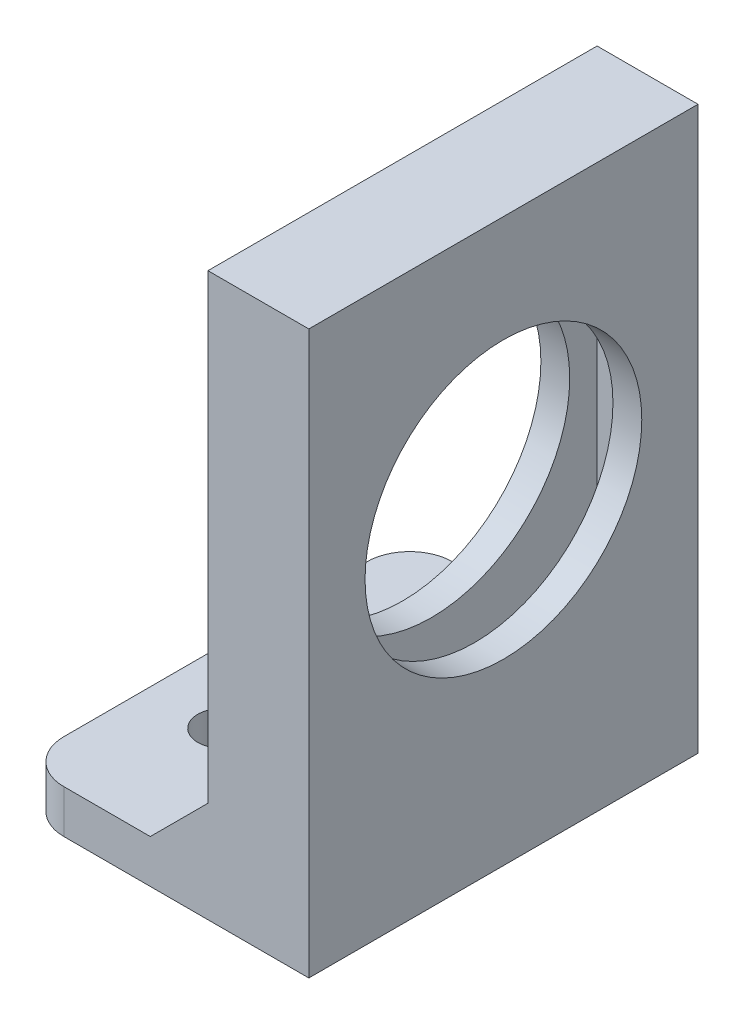
ISO-10303-21;
HEADER;
FILE_DESCRIPTION(('STEP AP214'),'2;1');
FILE_NAME('part.step','',(''),(''),'','','');
FILE_SCHEMA(('AUTOMOTIVE_DESIGN { 1 0 10303 214 1 1 1 1 }'));
ENDSEC;
DATA;
#1=APPLICATION_CONTEXT('core data for automotive mechanical design processes');
#2=APPLICATION_PROTOCOL_DEFINITION('international standard','automotive_design',2000,#1);
#3=PRODUCT_CONTEXT('',#1,'mechanical');
#4=PRODUCT('Part','Part','',(#3));
#5=PRODUCT_RELATED_PRODUCT_CATEGORY('part','',(#4));
#6=PRODUCT_DEFINITION_FORMATION('','',#4);
#7=PRODUCT_DEFINITION_CONTEXT('part definition',#1,'design');
#8=PRODUCT_DEFINITION('design','',#6,#7);
#9=PRODUCT_DEFINITION_SHAPE('','',#8);
#10=(LENGTH_UNIT() NAMED_UNIT(*) SI_UNIT(.MILLI.,.METRE.));
#11=(NAMED_UNIT(*) PLANE_ANGLE_UNIT() SI_UNIT($,.RADIAN.));
#12=(NAMED_UNIT(*) SI_UNIT($,.STERADIAN.) SOLID_ANGLE_UNIT());
#13=UNCERTAINTY_MEASURE_WITH_UNIT(LENGTH_MEASURE(1.E-05),#10,'distance_accuracy_value','');
#14=(GEOMETRIC_REPRESENTATION_CONTEXT(3) GLOBAL_UNCERTAINTY_ASSIGNED_CONTEXT((#13)) GLOBAL_UNIT_ASSIGNED_CONTEXT((#10,
#11,#12)) REPRESENTATION_CONTEXT('',''));
#15=CARTESIAN_POINT('',(0.,0.,0.));
#16=DIRECTION('',(0.,0.,1.));
#17=DIRECTION('',(1.,0.,0.));
#18=AXIS2_PLACEMENT_3D('',#15,#16,#17);
#19=CARTESIAN_POINT('',(0.,3.,0.));
#20=DIRECTION('',(0.,1.,0.));
#21=DIRECTION('',(0.,0.,1.));
#22=AXIS2_PLACEMENT_3D('',#19,#20,#21);
#23=PLANE('',#22);
#24=CARTESIAN_POINT('',(5.,3.,9.));
#25=DIRECTION('',(0.,1.,0.));
#26=DIRECTION('',(0.,0.,1.));
#27=AXIS2_PLACEMENT_3D('',#24,#25,#26);
#28=CIRCLE('',#27,1.7);
#29=CARTESIAN_POINT('',(5.,3.,10.7));
#30=VERTEX_POINT('',#29);
#31=EDGE_CURVE('E175',#30,#30,#28,.T.);
#32=ORIENTED_EDGE('',*,*,#31,.F.);
#33=EDGE_LOOP('',(#32));
#34=FACE_BOUND('',#33,.T.);
#35=CARTESIAN_POINT('',(5.,3.,18.));
#36=DIRECTION('',(0.,1.,0.));
#37=DIRECTION('',(0.,0.,1.));
#38=AXIS2_PLACEMENT_3D('',#35,#36,#37);
#39=CIRCLE('',#38,1.7);
#40=CARTESIAN_POINT('',(5.,3.,19.7));
#41=VERTEX_POINT('',#40);
#42=EDGE_CURVE('E178',#41,#41,#39,.T.);
#43=ORIENTED_EDGE('',*,*,#42,.F.);
#44=EDGE_LOOP('',(#43));
#45=FACE_BOUND('',#44,.T.);
#46=DIRECTION('',(-1.,0.,0.));
#47=VECTOR('',#46,1.);
#48=CARTESIAN_POINT('',(0.,3.,0.));
#49=LINE('',#48,#47);
#50=CARTESIAN_POINT('',(9.00000000000003,3.,0.));
#51=VERTEX_POINT('',#50);
#52=CARTESIAN_POINT('',(3.,3.,0.));
#53=VERTEX_POINT('',#52);
#54=EDGE_CURVE('E238',#51,#53,#49,.T.);
#55=ORIENTED_EDGE('',*,*,#54,.T.);
#56=CARTESIAN_POINT('',(3.,3.,3.));
#57=DIRECTION('',(0.,1.,0.));
#58=DIRECTION('',(0.,0.,1.));
#59=AXIS2_PLACEMENT_3D('',#56,#57,#58);
#60=CIRCLE('',#59,3.);
#61=CARTESIAN_POINT('',(0.,3.,3.));
#62=VERTEX_POINT('',#61);
#63=EDGE_CURVE('E50',#53,#62,#60,.T.);
#64=ORIENTED_EDGE('',*,*,#63,.T.);
#65=DIRECTION('',(0.,0.,1.));
#66=VECTOR('',#65,1.);
#67=CARTESIAN_POINT('',(0.,3.,0.));
#68=LINE('',#67,#66);
#69=CARTESIAN_POINT('',(0.,3.,24.));
#70=VERTEX_POINT('',#69);
#71=EDGE_CURVE('E231',#62,#70,#68,.T.);
#72=ORIENTED_EDGE('',*,*,#71,.T.);
#73=CARTESIAN_POINT('',(3.,3.,24.));
#74=DIRECTION('',(0.,1.,0.));
#75=DIRECTION('',(0.,0.,1.));
#76=AXIS2_PLACEMENT_3D('',#73,#74,#75);
#77=CIRCLE('',#76,3.);
#78=CARTESIAN_POINT('',(3.,3.,27.));
#79=VERTEX_POINT('',#78);
#80=EDGE_CURVE('E57',#70,#79,#77,.T.);
#81=ORIENTED_EDGE('',*,*,#80,.T.);
#82=DIRECTION('',(1.,0.,0.));
#83=VECTOR('',#82,1.);
#84=CARTESIAN_POINT('',(0.,3.,27.));
#85=LINE('',#84,#83);
#86=CARTESIAN_POINT('',(9.00000000000003,3.,27.));
#87=VERTEX_POINT('',#86);
#88=EDGE_CURVE('E234',#79,#87,#85,.T.);
#89=ORIENTED_EDGE('',*,*,#88,.T.);
#90=DIRECTION('',(0.,0.,-1.));
#91=VECTOR('',#90,1.);
#92=CARTESIAN_POINT('',(9.00000000000003,3.,0.));
#93=LINE('',#92,#91);
#94=EDGE_CURVE('E266',#87,#51,#93,.T.);
#95=ORIENTED_EDGE('',*,*,#94,.T.);
#96=EDGE_LOOP('',(#55,#64,#72,#81,#89,#95));
#97=FACE_BOUND('',#96,.T.);
#98=ADVANCED_FACE('F41',(#34,#45,#97),#23,.T.);
#99=CARTESIAN_POINT('',(0.,3.,0.));
#100=DIRECTION('',(1.,0.,0.));
#101=DIRECTION('',(0.,0.,-1.));
#102=AXIS2_PLACEMENT_3D('',#99,#100,#101);
#103=PLANE('',#102);
#104=ORIENTED_EDGE('',*,*,#71,.F.);
#105=DIRECTION('',(0.,-1.,0.));
#106=VECTOR('',#105,1.);
#107=CARTESIAN_POINT('',(0.,3.,3.));
#108=LINE('',#107,#106);
#109=CARTESIAN_POINT('',(0.,0.,3.));
#110=VERTEX_POINT('',#109);
#111=EDGE_CURVE('E278',#62,#110,#108,.T.);
#112=ORIENTED_EDGE('',*,*,#111,.T.);
#113=DIRECTION('',(0.,0.,1.));
#114=VECTOR('',#113,1.);
#115=CARTESIAN_POINT('',(0.,0.,0.));
#116=LINE('',#115,#114);
#117=CARTESIAN_POINT('',(0.,0.,24.));
#118=VERTEX_POINT('',#117);
#119=EDGE_CURVE('E227',#110,#118,#116,.T.);
#120=ORIENTED_EDGE('',*,*,#119,.T.);
#121=DIRECTION('',(0.,-1.,0.));
#122=VECTOR('',#121,1.);
#123=CARTESIAN_POINT('',(0.,3.,24.));
#124=LINE('',#123,#122);
#125=EDGE_CURVE('E275',#118,#70,#124,.F.);
#126=ORIENTED_EDGE('',*,*,#125,.T.);
#127=EDGE_LOOP('',(#104,#112,#120,#126));
#128=FACE_BOUND('',#127,.T.);
#129=ADVANCED_FACE('F297',(#128),#103,.F.);
#130=CARTESIAN_POINT('',(0.,3.,27.));
#131=DIRECTION('',(0.,0.,-1.));
#132=DIRECTION('',(-1.,0.,0.));
#133=AXIS2_PLACEMENT_3D('',#130,#131,#132);
#134=PLANE('',#133);
#135=ORIENTED_EDGE('',*,*,#88,.F.);
#136=DIRECTION('',(0.,-1.,0.));
#137=VECTOR('',#136,1.);
#138=CARTESIAN_POINT('',(3.,3.,27.));
#139=LINE('',#138,#137);
#140=CARTESIAN_POINT('',(3.,0.,27.));
#141=VERTEX_POINT('',#140);
#142=EDGE_CURVE('E11',#79,#141,#139,.T.);
#143=ORIENTED_EDGE('',*,*,#142,.T.);
#144=DIRECTION('',(1.,0.,0.));
#145=VECTOR('',#144,1.);
#146=CARTESIAN_POINT('',(0.,0.,27.));
#147=LINE('',#146,#145);
#148=CARTESIAN_POINT('',(20.,0.,27.));
#149=VERTEX_POINT('',#148);
#150=EDGE_CURVE('E245',#141,#149,#147,.T.);
#151=ORIENTED_EDGE('',*,*,#150,.T.);
#152=DIRECTION('',(0.,-1.,0.));
#153=VECTOR('',#152,1.);
#154=CARTESIAN_POINT('',(20.,3.,27.));
#155=LINE('',#154,#153);
#156=CARTESIAN_POINT('',(20.,39.,27.));
#157=VERTEX_POINT('',#156);
#158=EDGE_CURVE('E159',#157,#149,#155,.T.);
#159=ORIENTED_EDGE('',*,*,#158,.F.);
#160=DIRECTION('',(1.,0.,0.));
#161=VECTOR('',#160,1.);
#162=CARTESIAN_POINT('',(13.,39.,27.));
#163=LINE('',#162,#161);
#164=CARTESIAN_POINT('',(13.,39.,27.));
#165=VERTEX_POINT('',#164);
#166=EDGE_CURVE('E156',#165,#157,#163,.T.);
#167=ORIENTED_EDGE('',*,*,#166,.F.);
#168=DIRECTION('',(0.,-1.,0.));
#169=VECTOR('',#168,1.);
#170=CARTESIAN_POINT('',(13.,37.,27.));
#171=LINE('',#170,#169);
#172=CARTESIAN_POINT('',(13.,7.00000000000002,27.));
#173=VERTEX_POINT('',#172);
#174=EDGE_CURVE('E141',#165,#173,#171,.T.);
#175=ORIENTED_EDGE('',*,*,#174,.T.);
#176=DIRECTION('',(-0.707106781186543,-0.707106781186552,0.));
#177=VECTOR('',#176,1.);
#178=CARTESIAN_POINT('',(4.50000000000007,-1.50000000000001,27.));
#179=LINE('',#178,#177);
#180=EDGE_CURVE('E269',#173,#87,#179,.T.);
#181=ORIENTED_EDGE('',*,*,#180,.T.);
#182=EDGE_LOOP('',(#135,#143,#151,#159,#167,#175,#181));
#183=FACE_BOUND('',#182,.T.);
#184=ADVANCED_FACE('F157',(#183),#134,.F.);
#185=CARTESIAN_POINT('',(20.,3.,0.));
#186=DIRECTION('',(-1.,0.,0.));
#187=DIRECTION('',(0.,0.,1.));
#188=AXIS2_PLACEMENT_3D('',#185,#186,#187);
#189=PLANE('',#188);
#190=CARTESIAN_POINT('',(20.,22.,13.5));
#191=DIRECTION('',(1.,0.,0.));
#192=DIRECTION('',(0.,0.,-1.));
#193=AXIS2_PLACEMENT_3D('',#190,#191,#192);
#194=CIRCLE('',#193,9.6);
#195=CARTESIAN_POINT('',(20.,22.,3.9));
#196=VERTEX_POINT('',#195);
#197=EDGE_CURVE('E263',#196,#196,#194,.T.);
#198=ORIENTED_EDGE('',*,*,#197,.F.);
#199=EDGE_LOOP('',(#198));
#200=FACE_BOUND('',#199,.T.);
#201=DIRECTION('',(0.,0.,-1.));
#202=VECTOR('',#201,1.);
#203=CARTESIAN_POINT('',(20.,0.,0.));
#204=LINE('',#203,#202);
#205=CARTESIAN_POINT('',(20.,0.,0.));
#206=VERTEX_POINT('',#205);
#207=EDGE_CURVE('E248',#149,#206,#204,.T.);
#208=ORIENTED_EDGE('',*,*,#207,.T.);
#209=DIRECTION('',(0.,-1.,0.));
#210=VECTOR('',#209,1.);
#211=CARTESIAN_POINT('',(20.,3.,0.));
#212=LINE('',#211,#210);
#213=CARTESIAN_POINT('',(20.,39.,0.));
#214=VERTEX_POINT('',#213);
#215=EDGE_CURVE('E241',#214,#206,#212,.T.);
#216=ORIENTED_EDGE('',*,*,#215,.F.);
#217=DIRECTION('',(0.,0.,-1.));
#218=VECTOR('',#217,1.);
#219=CARTESIAN_POINT('',(20.,39.,0.));
#220=LINE('',#219,#218);
#221=EDGE_CURVE('E164',#157,#214,#220,.T.);
#222=ORIENTED_EDGE('',*,*,#221,.F.);
#223=ORIENTED_EDGE('',*,*,#158,.T.);
#224=EDGE_LOOP('',(#208,#216,#222,#223));
#225=FACE_BOUND('',#224,.T.);
#226=ADVANCED_FACE('F307',(#200,#225),#189,.F.);
#227=CARTESIAN_POINT('',(0.,3.,0.));
#228=DIRECTION('',(0.,0.,1.));
#229=DIRECTION('',(1.,0.,0.));
#230=AXIS2_PLACEMENT_3D('',#227,#228,#229);
#231=PLANE('',#230);
#232=DIRECTION('',(-1.,0.,0.));
#233=VECTOR('',#232,1.);
#234=CARTESIAN_POINT('',(0.,0.,0.));
#235=LINE('',#234,#233);
#236=CARTESIAN_POINT('',(3.,0.,0.));
#237=VERTEX_POINT('',#236);
#238=EDGE_CURVE('E235',#206,#237,#235,.T.);
#239=ORIENTED_EDGE('',*,*,#238,.T.);
#240=DIRECTION('',(0.,-1.,0.));
#241=VECTOR('',#240,1.);
#242=CARTESIAN_POINT('',(3.,3.,0.));
#243=LINE('',#242,#241);
#244=EDGE_CURVE('E65',#237,#53,#243,.F.);
#245=ORIENTED_EDGE('',*,*,#244,.T.);
#246=ORIENTED_EDGE('',*,*,#54,.F.);
#247=DIRECTION('',(0.707106781186543,0.707106781186552,0.));
#248=VECTOR('',#247,1.);
#249=CARTESIAN_POINT('',(4.50000000000007,-1.50000000000001,0.));
#250=LINE('',#249,#248);
#251=CARTESIAN_POINT('',(13.,7.00000000000002,0.));
#252=VERTEX_POINT('',#251);
#253=EDGE_CURVE('E272',#51,#252,#250,.T.);
#254=ORIENTED_EDGE('',*,*,#253,.T.);
#255=DIRECTION('',(0.,-1.,0.));
#256=VECTOR('',#255,1.);
#257=CARTESIAN_POINT('',(13.,37.,0.));
#258=LINE('',#257,#256);
#259=CARTESIAN_POINT('',(13.,39.,0.));
#260=VERTEX_POINT('',#259);
#261=EDGE_CURVE('E152',#260,#252,#258,.T.);
#262=ORIENTED_EDGE('',*,*,#261,.F.);
#263=DIRECTION('',(-1.,0.,0.));
#264=VECTOR('',#263,1.);
#265=CARTESIAN_POINT('',(13.,39.,0.));
#266=LINE('',#265,#264);
#267=EDGE_CURVE('E169',#214,#260,#266,.T.);
#268=ORIENTED_EDGE('',*,*,#267,.F.);
#269=ORIENTED_EDGE('',*,*,#215,.T.);
#270=EDGE_LOOP('',(#239,#245,#246,#254,#262,#268,#269));
#271=FACE_BOUND('',#270,.T.);
#272=ADVANCED_FACE('F305',(#271),#231,.F.);
#273=CARTESIAN_POINT('',(0.,0.,0.));
#274=DIRECTION('',(0.,1.,0.));
#275=DIRECTION('',(0.,0.,1.));
#276=AXIS2_PLACEMENT_3D('',#273,#274,#275);
#277=PLANE('',#276);
#278=CARTESIAN_POINT('',(5.,0.,9.));
#279=DIRECTION('',(0.,1.,0.));
#280=DIRECTION('',(0.,0.,1.));
#281=AXIS2_PLACEMENT_3D('',#278,#279,#280);
#282=CIRCLE('',#281,1.7);
#283=CARTESIAN_POINT('',(5.,0.,10.7));
#284=VERTEX_POINT('',#283);
#285=EDGE_CURVE('E171',#284,#284,#282,.T.);
#286=ORIENTED_EDGE('',*,*,#285,.T.);
#287=EDGE_LOOP('',(#286));
#288=FACE_BOUND('',#287,.T.);
#289=CARTESIAN_POINT('',(5.,0.,18.));
#290=DIRECTION('',(0.,1.,0.));
#291=DIRECTION('',(0.,0.,1.));
#292=AXIS2_PLACEMENT_3D('',#289,#290,#291);
#293=CIRCLE('',#292,1.7);
#294=CARTESIAN_POINT('',(5.,0.,19.7));
#295=VERTEX_POINT('',#294);
#296=EDGE_CURVE('E386',#295,#295,#293,.T.);
#297=ORIENTED_EDGE('',*,*,#296,.T.);
#298=EDGE_LOOP('',(#297));
#299=FACE_BOUND('',#298,.T.);
#300=ORIENTED_EDGE('',*,*,#119,.F.);
#301=CARTESIAN_POINT('',(3.,0.,3.));
#302=DIRECTION('',(0.,1.,0.));
#303=DIRECTION('',(0.,0.,1.));
#304=AXIS2_PLACEMENT_3D('',#301,#302,#303);
#305=CIRCLE('',#304,3.);
#306=EDGE_CURVE('E285',#110,#237,#305,.F.);
#307=ORIENTED_EDGE('',*,*,#306,.T.);
#308=ORIENTED_EDGE('',*,*,#238,.F.);
#309=ORIENTED_EDGE('',*,*,#207,.F.);
#310=ORIENTED_EDGE('',*,*,#150,.F.);
#311=CARTESIAN_POINT('',(3.,0.,24.));
#312=DIRECTION('',(0.,1.,0.));
#313=DIRECTION('',(0.,0.,1.));
#314=AXIS2_PLACEMENT_3D('',#311,#312,#313);
#315=CIRCLE('',#314,3.);
#316=EDGE_CURVE('E282',#141,#118,#315,.F.);
#317=ORIENTED_EDGE('',*,*,#316,.T.);
#318=EDGE_LOOP('',(#300,#307,#308,#309,#310,#317));
#319=FACE_BOUND('',#318,.T.);
#320=ADVANCED_FACE('F303',(#288,#299,#319),#277,.F.);
#321=CARTESIAN_POINT('',(13.,37.,0.));
#322=DIRECTION('',(1.,0.,0.));
#323=DIRECTION('',(0.,0.,-1.));
#324=AXIS2_PLACEMENT_3D('',#321,#322,#323);
#325=PLANE('',#324);
#326=CARTESIAN_POINT('',(13.,22.,13.5));
#327=DIRECTION('',(1.,0.,0.));
#328=DIRECTION('',(0.,0.,-1.));
#329=AXIS2_PLACEMENT_3D('',#326,#327,#328);
#330=CIRCLE('',#329,9.6);
#331=CARTESIAN_POINT('',(13.,22.,3.9));
#332=VERTEX_POINT('',#331);
#333=EDGE_CURVE('E379',#332,#332,#330,.T.);
#334=ORIENTED_EDGE('',*,*,#333,.T.);
#335=EDGE_LOOP('',(#334));
#336=FACE_BOUND('',#335,.T.);
#337=ORIENTED_EDGE('',*,*,#261,.T.);
#338=DIRECTION('',(0.,0.,1.));
#339=VECTOR('',#338,1.);
#340=CARTESIAN_POINT('',(13.,7.00000000000002,0.));
#341=LINE('',#340,#339);
#342=EDGE_CURVE('E148',#252,#173,#341,.T.);
#343=ORIENTED_EDGE('',*,*,#342,.T.);
#344=ORIENTED_EDGE('',*,*,#174,.F.);
#345=DIRECTION('',(0.,0.,1.));
#346=VECTOR('',#345,1.);
#347=CARTESIAN_POINT('',(13.,39.,0.));
#348=LINE('',#347,#346);
#349=EDGE_CURVE('E146',#260,#165,#348,.T.);
#350=ORIENTED_EDGE('',*,*,#349,.F.);
#351=EDGE_LOOP('',(#337,#343,#344,#350));
#352=FACE_BOUND('',#351,.T.);
#353=ADVANCED_FACE('F144',(#336,#352),#325,.F.);
#354=CARTESIAN_POINT('',(0.,39.,0.));
#355=DIRECTION('',(0.,1.,0.));
#356=DIRECTION('',(0.,0.,1.));
#357=AXIS2_PLACEMENT_3D('',#354,#355,#356);
#358=PLANE('',#357);
#359=ORIENTED_EDGE('',*,*,#349,.T.);
#360=ORIENTED_EDGE('',*,*,#166,.T.);
#361=ORIENTED_EDGE('',*,*,#221,.T.);
#362=ORIENTED_EDGE('',*,*,#267,.T.);
#363=EDGE_LOOP('',(#359,#360,#361,#362));
#364=FACE_BOUND('',#363,.T.);
#365=ADVANCED_FACE('F167',(#364),#358,.T.);
#366=CARTESIAN_POINT('',(5.,0.,18.));
#367=DIRECTION('',(0.,1.,0.));
#368=DIRECTION('',(0.,0.,1.));
#369=AXIS2_PLACEMENT_3D('',#366,#367,#368);
#370=CYLINDRICAL_SURFACE('',#369,1.7);
#371=ORIENTED_EDGE('',*,*,#296,.F.);
#372=EDGE_LOOP('',(#371));
#373=FACE_BOUND('',#372,.T.);
#374=ORIENTED_EDGE('',*,*,#42,.T.);
#375=EDGE_LOOP('',(#374));
#376=FACE_BOUND('',#375,.T.);
#377=ADVANCED_FACE('F375',(#373,#376),#370,.F.);
#378=CARTESIAN_POINT('',(5.,0.,9.));
#379=DIRECTION('',(0.,1.,0.));
#380=DIRECTION('',(0.,0.,1.));
#381=AXIS2_PLACEMENT_3D('',#378,#379,#380);
#382=CYLINDRICAL_SURFACE('',#381,1.7);
#383=ORIENTED_EDGE('',*,*,#285,.F.);
#384=EDGE_LOOP('',(#383));
#385=FACE_BOUND('',#384,.T.);
#386=ORIENTED_EDGE('',*,*,#31,.T.);
#387=EDGE_LOOP('',(#386));
#388=FACE_BOUND('',#387,.T.);
#389=ADVANCED_FACE('F400',(#385,#388),#382,.F.);
#390=CARTESIAN_POINT('',(-30.,22.,13.5));
#391=DIRECTION('',(1.,0.,0.));
#392=DIRECTION('',(0.,0.,-1.));
#393=AXIS2_PLACEMENT_3D('',#390,#391,#392);
#394=CYLINDRICAL_SURFACE('',#393,9.6);
#395=CARTESIAN_POINT('',(15.,22.,13.5));
#396=DIRECTION('',(-1.,0.,0.));
#397=DIRECTION('',(0.,0.,1.));
#398=AXIS2_PLACEMENT_3D('',#395,#396,#397);
#399=CIRCLE('',#398,9.6);
#400=CARTESIAN_POINT('',(15.,22.,23.1));
#401=VERTEX_POINT('',#400);
#402=EDGE_CURVE('E258',#401,#401,#399,.T.);
#403=ORIENTED_EDGE('',*,*,#402,.F.);
#404=EDGE_LOOP('',(#403));
#405=FACE_BOUND('',#404,.T.);
#406=ORIENTED_EDGE('',*,*,#333,.F.);
#407=EDGE_LOOP('',(#406));
#408=FACE_BOUND('',#407,.T.);
#409=ADVANCED_FACE('F406',(#405,#408),#394,.F.);
#410=ORIENTED_EDGE('',*,*,#197,.T.);
#411=EDGE_LOOP('',(#410));
#412=FACE_BOUND('',#411,.T.);
#413=CARTESIAN_POINT('',(18.,22.,13.5));
#414=DIRECTION('',(1.,0.,0.));
#415=DIRECTION('',(0.,0.,-1.));
#416=AXIS2_PLACEMENT_3D('',#413,#414,#415);
#417=CIRCLE('',#416,9.6);
#418=CARTESIAN_POINT('',(18.,22.,3.9));
#419=VERTEX_POINT('',#418);
#420=EDGE_CURVE('E262',#419,#419,#417,.T.);
#421=ORIENTED_EDGE('',*,*,#420,.F.);
#422=EDGE_LOOP('',(#421));
#423=FACE_BOUND('',#422,.T.);
#424=ADVANCED_FACE('F338',(#412,#423),#394,.F.);
#425=CARTESIAN_POINT('',(0.,37.,0.));
#426=DIRECTION('',(0.,1.,0.));
#427=DIRECTION('',(0.,0.,1.));
#428=AXIS2_PLACEMENT_3D('',#425,#426,#427);
#429=PLANE('',#428);
#430=DIRECTION('',(0.,0.,1.));
#431=VECTOR('',#430,1.);
#432=CARTESIAN_POINT('',(18.,37.,0.));
#433=LINE('',#432,#431);
#434=CARTESIAN_POINT('',(18.,37.,2.));
#435=VERTEX_POINT('',#434);
#436=CARTESIAN_POINT('',(18.,37.,25.));
#437=VERTEX_POINT('',#436);
#438=EDGE_CURVE('E223',#435,#437,#433,.T.);
#439=ORIENTED_EDGE('',*,*,#438,.T.);
#440=DIRECTION('',(-1.,0.,0.));
#441=VECTOR('',#440,1.);
#442=CARTESIAN_POINT('',(15.,37.,25.));
#443=LINE('',#442,#441);
#444=CARTESIAN_POINT('',(15.,37.,25.));
#445=VERTEX_POINT('',#444);
#446=EDGE_CURVE('E186',#437,#445,#443,.T.);
#447=ORIENTED_EDGE('',*,*,#446,.T.);
#448=DIRECTION('',(0.,0.,-1.));
#449=VECTOR('',#448,1.);
#450=CARTESIAN_POINT('',(15.,37.,0.));
#451=LINE('',#450,#449);
#452=CARTESIAN_POINT('',(15.,37.,2.));
#453=VERTEX_POINT('',#452);
#454=EDGE_CURVE('E153',#445,#453,#451,.T.);
#455=ORIENTED_EDGE('',*,*,#454,.T.);
#456=DIRECTION('',(1.,0.,0.));
#457=VECTOR('',#456,1.);
#458=CARTESIAN_POINT('',(15.,37.,2.));
#459=LINE('',#458,#457);
#460=EDGE_CURVE('E200',#453,#435,#459,.T.);
#461=ORIENTED_EDGE('',*,*,#460,.T.);
#462=EDGE_LOOP('',(#439,#447,#455,#461));
#463=FACE_BOUND('',#462,.T.);
#464=ADVANCED_FACE('F330',(#463),#429,.F.);
#465=DIRECTION('',(0.,0.,-1.));
#466=VECTOR('',#465,1.);
#467=CARTESIAN_POINT('',(15.,3.,0.));
#468=LINE('',#467,#466);
#469=CARTESIAN_POINT('',(15.,3.,25.));
#470=VERTEX_POINT('',#469);
#471=CARTESIAN_POINT('',(15.,3.,2.));
#472=VERTEX_POINT('',#471);
#473=EDGE_CURVE('E214',#470,#472,#468,.T.);
#474=ORIENTED_EDGE('',*,*,#473,.F.);
#475=DIRECTION('',(-1.,0.,0.));
#476=VECTOR('',#475,1.);
#477=CARTESIAN_POINT('',(15.,3.,25.));
#478=LINE('',#477,#476);
#479=CARTESIAN_POINT('',(18.,3.,25.));
#480=VERTEX_POINT('',#479);
#481=EDGE_CURVE('E185',#480,#470,#478,.T.);
#482=ORIENTED_EDGE('',*,*,#481,.F.);
#483=DIRECTION('',(0.,0.,1.));
#484=VECTOR('',#483,1.);
#485=CARTESIAN_POINT('',(18.,3.,0.));
#486=LINE('',#485,#484);
#487=CARTESIAN_POINT('',(18.,3.,2.));
#488=VERTEX_POINT('',#487);
#489=EDGE_CURVE('E222',#488,#480,#486,.T.);
#490=ORIENTED_EDGE('',*,*,#489,.F.);
#491=DIRECTION('',(1.,0.,0.));
#492=VECTOR('',#491,1.);
#493=CARTESIAN_POINT('',(15.,3.,2.));
#494=LINE('',#493,#492);
#495=EDGE_CURVE('E199',#472,#488,#494,.T.);
#496=ORIENTED_EDGE('',*,*,#495,.F.);
#497=EDGE_LOOP('',(#474,#482,#490,#496));
#498=FACE_BOUND('',#497,.T.);
#499=ADVANCED_FACE('F319',(#498),#23,.T.);
#500=CARTESIAN_POINT('',(18.,37.,0.));
#501=DIRECTION('',(1.,0.,0.));
#502=DIRECTION('',(0.,0.,-1.));
#503=AXIS2_PLACEMENT_3D('',#500,#501,#502);
#504=PLANE('',#503);
#505=ORIENTED_EDGE('',*,*,#420,.T.);
#506=EDGE_LOOP('',(#505));
#507=FACE_BOUND('',#506,.T.);
#508=DIRECTION('',(0.,-1.,0.));
#509=VECTOR('',#508,1.);
#510=CARTESIAN_POINT('',(18.,37.,25.));
#511=LINE('',#510,#509);
#512=EDGE_CURVE('E196',#437,#480,#511,.T.);
#513=ORIENTED_EDGE('',*,*,#512,.F.);
#514=ORIENTED_EDGE('',*,*,#438,.F.);
#515=DIRECTION('',(0.,-1.,0.));
#516=VECTOR('',#515,1.);
#517=CARTESIAN_POINT('',(18.,37.,2.));
#518=LINE('',#517,#516);
#519=EDGE_CURVE('E204',#435,#488,#518,.T.);
#520=ORIENTED_EDGE('',*,*,#519,.T.);
#521=ORIENTED_EDGE('',*,*,#489,.T.);
#522=EDGE_LOOP('',(#513,#514,#520,#521));
#523=FACE_BOUND('',#522,.T.);
#524=ADVANCED_FACE('F329',(#507,#523),#504,.F.);
#525=CARTESIAN_POINT('',(15.,37.,2.));
#526=DIRECTION('',(0.,0.,-1.));
#527=DIRECTION('',(-1.,0.,0.));
#528=AXIS2_PLACEMENT_3D('',#525,#526,#527);
#529=PLANE('',#528);
#530=ORIENTED_EDGE('',*,*,#495,.T.);
#531=ORIENTED_EDGE('',*,*,#519,.F.);
#532=ORIENTED_EDGE('',*,*,#460,.F.);
#533=DIRECTION('',(0.,-1.,0.));
#534=VECTOR('',#533,1.);
#535=CARTESIAN_POINT('',(15.,37.,2.));
#536=LINE('',#535,#534);
#537=EDGE_CURVE('E210',#453,#472,#536,.T.);
#538=ORIENTED_EDGE('',*,*,#537,.T.);
#539=EDGE_LOOP('',(#530,#531,#532,#538));
#540=FACE_BOUND('',#539,.T.);
#541=ADVANCED_FACE('F336',(#540),#529,.F.);
#542=CARTESIAN_POINT('',(15.,37.,0.));
#543=DIRECTION('',(-1.,0.,0.));
#544=DIRECTION('',(0.,0.,1.));
#545=AXIS2_PLACEMENT_3D('',#542,#543,#544);
#546=PLANE('',#545);
#547=ORIENTED_EDGE('',*,*,#402,.T.);
#548=EDGE_LOOP('',(#547));
#549=FACE_BOUND('',#548,.T.);
#550=DIRECTION('',(0.,-1.,0.));
#551=VECTOR('',#550,1.);
#552=CARTESIAN_POINT('',(15.,37.,25.));
#553=LINE('',#552,#551);
#554=EDGE_CURVE('E190',#445,#470,#553,.T.);
#555=ORIENTED_EDGE('',*,*,#554,.T.);
#556=ORIENTED_EDGE('',*,*,#473,.T.);
#557=ORIENTED_EDGE('',*,*,#537,.F.);
#558=ORIENTED_EDGE('',*,*,#454,.F.);
#559=EDGE_LOOP('',(#555,#556,#557,#558));
#560=FACE_BOUND('',#559,.T.);
#561=ADVANCED_FACE('F347',(#549,#560),#546,.F.);
#562=CARTESIAN_POINT('',(15.,37.,25.));
#563=DIRECTION('',(0.,0.,1.));
#564=DIRECTION('',(1.,0.,0.));
#565=AXIS2_PLACEMENT_3D('',#562,#563,#564);
#566=PLANE('',#565);
#567=ORIENTED_EDGE('',*,*,#481,.T.);
#568=ORIENTED_EDGE('',*,*,#554,.F.);
#569=ORIENTED_EDGE('',*,*,#446,.F.);
#570=ORIENTED_EDGE('',*,*,#512,.T.);
#571=EDGE_LOOP('',(#567,#568,#569,#570));
#572=FACE_BOUND('',#571,.T.);
#573=ADVANCED_FACE('F353',(#572),#566,.F.);
#574=CARTESIAN_POINT('',(13.,7.00000000000002,0.));
#575=DIRECTION('',(0.707106781186552,-0.707106781186543,0.));
#576=DIRECTION('',(0.,0.,1.));
#577=AXIS2_PLACEMENT_3D('',#574,#575,#576);
#578=PLANE('',#577);
#579=ORIENTED_EDGE('',*,*,#253,.F.);
#580=ORIENTED_EDGE('',*,*,#94,.F.);
#581=ORIENTED_EDGE('',*,*,#180,.F.);
#582=ORIENTED_EDGE('',*,*,#342,.F.);
#583=EDGE_LOOP('',(#579,#580,#581,#582));
#584=FACE_BOUND('',#583,.T.);
#585=ADVANCED_FACE('F315',(#584),#578,.F.);
#586=CARTESIAN_POINT('',(3.,3.,3.));
#587=DIRECTION('',(0.,-1.,0.));
#588=DIRECTION('',(0.,0.,-1.));
#589=AXIS2_PLACEMENT_3D('',#586,#587,#588);
#590=CYLINDRICAL_SURFACE('',#589,3.);
#591=ORIENTED_EDGE('',*,*,#63,.F.);
#592=ORIENTED_EDGE('',*,*,#244,.F.);
#593=ORIENTED_EDGE('',*,*,#306,.F.);
#594=ORIENTED_EDGE('',*,*,#111,.F.);
#595=EDGE_LOOP('',(#591,#592,#593,#594));
#596=FACE_BOUND('',#595,.T.);
#597=ADVANCED_FACE('F300',(#596),#590,.T.);
#598=CARTESIAN_POINT('',(3.,3.,24.));
#599=DIRECTION('',(0.,-1.,0.));
#600=DIRECTION('',(0.,0.,-1.));
#601=AXIS2_PLACEMENT_3D('',#598,#599,#600);
#602=CYLINDRICAL_SURFACE('',#601,3.);
#603=ORIENTED_EDGE('',*,*,#80,.F.);
#604=ORIENTED_EDGE('',*,*,#125,.F.);
#605=ORIENTED_EDGE('',*,*,#316,.F.);
#606=ORIENTED_EDGE('',*,*,#142,.F.);
#607=EDGE_LOOP('',(#603,#604,#605,#606));
#608=FACE_BOUND('',#607,.T.);
#609=ADVANCED_FACE('F43',(#608),#602,.T.);
#610=CLOSED_SHELL('',(#98,#129,#184,#226,#272,#320,#353,#365,#377,#389,#409,#424,#464,#499,#524,
#541,#561,#573,#585,#597,#609));
#611=MANIFOLD_SOLID_BREP('B2',#610);
#612=ADVANCED_BREP_SHAPE_REPRESENTATION('',(#18,#611),#14);
#613=SHAPE_DEFINITION_REPRESENTATION(#9,#612);
ENDSEC;
END-ISO-10303-21;
